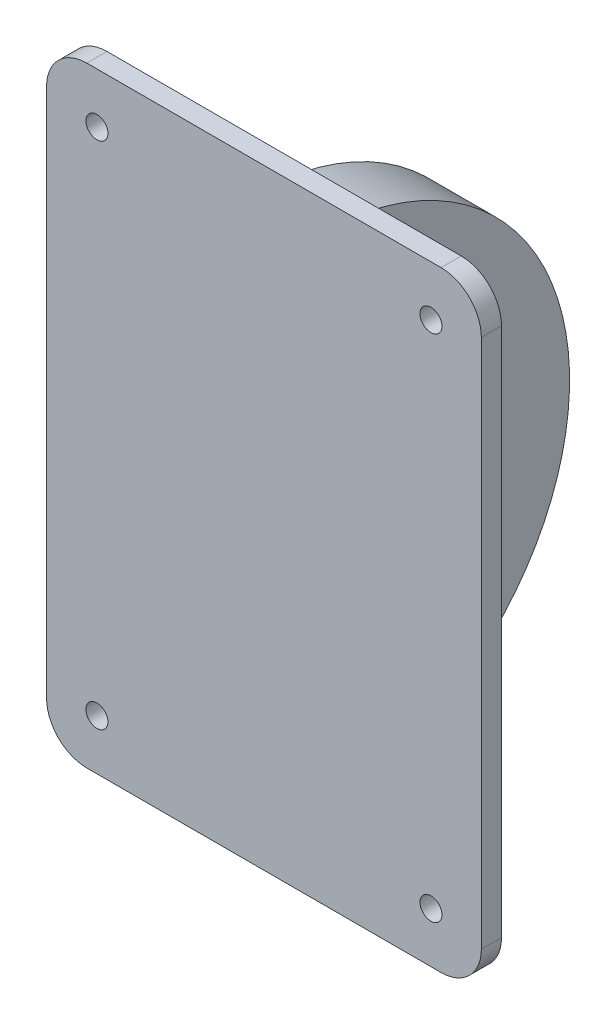
ISO-10303-21;
HEADER;
FILE_DESCRIPTION(('STEP AP214'),'2;1');
FILE_NAME('part.step','',(''),(''),'','','');
FILE_SCHEMA(('AUTOMOTIVE_DESIGN { 1 0 10303 214 1 1 1 1 }'));
ENDSEC;
DATA;
#1=APPLICATION_CONTEXT('core data for automotive mechanical design processes');
#2=APPLICATION_PROTOCOL_DEFINITION('international standard','automotive_design',2000,#1);
#3=PRODUCT_CONTEXT('',#1,'mechanical');
#4=PRODUCT('Part','Part','',(#3));
#5=PRODUCT_RELATED_PRODUCT_CATEGORY('part','',(#4));
#6=PRODUCT_DEFINITION_FORMATION('','',#4);
#7=PRODUCT_DEFINITION_CONTEXT('part definition',#1,'design');
#8=PRODUCT_DEFINITION('design','',#6,#7);
#9=PRODUCT_DEFINITION_SHAPE('','',#8);
#10=(LENGTH_UNIT() NAMED_UNIT(*) SI_UNIT(.MILLI.,.METRE.));
#11=(NAMED_UNIT(*) PLANE_ANGLE_UNIT() SI_UNIT($,.RADIAN.));
#12=(NAMED_UNIT(*) SI_UNIT($,.STERADIAN.) SOLID_ANGLE_UNIT());
#13=UNCERTAINTY_MEASURE_WITH_UNIT(LENGTH_MEASURE(1.E-05),#10,'distance_accuracy_value','');
#14=(GEOMETRIC_REPRESENTATION_CONTEXT(3) GLOBAL_UNCERTAINTY_ASSIGNED_CONTEXT((#13)) GLOBAL_UNIT_ASSIGNED_CONTEXT((#10,
#11,#12)) REPRESENTATION_CONTEXT('',''));
#15=CARTESIAN_POINT('',(0.,0.,0.));
#16=DIRECTION('',(0.,0.,1.));
#17=DIRECTION('',(1.,0.,0.));
#18=AXIS2_PLACEMENT_3D('',#15,#16,#17);
#19=CARTESIAN_POINT('',(21.57545,30.294115,2.));
#20=DIRECTION('',(-1.,0.,0.));
#21=DIRECTION('',(0.,-1.,0.));
#22=AXIS2_PLACEMENT_3D('',#19,#20,#21);
#23=PLANE('',#22);
#24=DIRECTION('',(0.,1.,0.));
#25=VECTOR('',#24,1.);
#26=CARTESIAN_POINT('',(21.57545,30.294115,2.));
#27=LINE('',#26,#25);
#28=CARTESIAN_POINT('',(21.57545,-26.294115,2.));
#29=VERTEX_POINT('',#28);
#30=CARTESIAN_POINT('',(21.57545,26.294115,2.));
#31=VERTEX_POINT('',#30);
#32=EDGE_CURVE('E163',#29,#31,#27,.T.);
#33=ORIENTED_EDGE('',*,*,#32,.F.);
#34=DIRECTION('',(0.,0.,-1.));
#35=VECTOR('',#34,1.);
#36=CARTESIAN_POINT('',(21.57545,-26.294115,2.));
#37=LINE('',#36,#35);
#38=CARTESIAN_POINT('',(21.57545,-26.294115,0.));
#39=VERTEX_POINT('',#38);
#40=EDGE_CURVE('E214',#29,#39,#37,.T.);
#41=ORIENTED_EDGE('',*,*,#40,.T.);
#42=DIRECTION('',(0.,1.,0.));
#43=VECTOR('',#42,1.);
#44=CARTESIAN_POINT('',(21.57545,30.294115,0.));
#45=LINE('',#44,#43);
#46=CARTESIAN_POINT('',(21.57545,26.294115,0.));
#47=VERTEX_POINT('',#46);
#48=EDGE_CURVE('E160',#39,#47,#45,.T.);
#49=ORIENTED_EDGE('',*,*,#48,.T.);
#50=DIRECTION('',(0.,0.,-1.));
#51=VECTOR('',#50,1.);
#52=CARTESIAN_POINT('',(21.57545,26.294115,2.));
#53=LINE('',#52,#51);
#54=EDGE_CURVE('E212',#47,#31,#53,.F.);
#55=ORIENTED_EDGE('',*,*,#54,.T.);
#56=EDGE_LOOP('',(#33,#41,#49,#55));
#57=FACE_BOUND('',#56,.T.);
#58=ADVANCED_FACE('F41',(#57),#23,.F.);
#59=CARTESIAN_POINT('',(-21.57545,30.294115,2.));
#60=DIRECTION('',(0.,-1.,0.));
#61=DIRECTION('',(0.,0.,-1.));
#62=AXIS2_PLACEMENT_3D('',#59,#60,#61);
#63=PLANE('',#62);
#64=DIRECTION('',(-1.,0.,0.));
#65=VECTOR('',#64,1.);
#66=CARTESIAN_POINT('',(-21.57545,30.294115,0.));
#67=LINE('',#66,#65);
#68=CARTESIAN_POINT('',(17.57545,30.294115,0.));
#69=VERTEX_POINT('',#68);
#70=CARTESIAN_POINT('',(-17.57545,30.294115,0.));
#71=VERTEX_POINT('',#70);
#72=EDGE_CURVE('E179',#69,#71,#67,.T.);
#73=ORIENTED_EDGE('',*,*,#72,.T.);
#74=DIRECTION('',(0.,0.,-1.));
#75=VECTOR('',#74,1.);
#76=CARTESIAN_POINT('',(-17.57545,30.294115,2.));
#77=LINE('',#76,#75);
#78=CARTESIAN_POINT('',(-17.57545,30.294115,2.));
#79=VERTEX_POINT('',#78);
#80=EDGE_CURVE('E11',#71,#79,#77,.F.);
#81=ORIENTED_EDGE('',*,*,#80,.T.);
#82=DIRECTION('',(-1.,0.,0.));
#83=VECTOR('',#82,1.);
#84=CARTESIAN_POINT('',(-21.57545,30.294115,2.));
#85=LINE('',#84,#83);
#86=CARTESIAN_POINT('',(17.57545,30.294115,2.));
#87=VERTEX_POINT('',#86);
#88=EDGE_CURVE('E166',#87,#79,#85,.T.);
#89=ORIENTED_EDGE('',*,*,#88,.F.);
#90=DIRECTION('',(0.,0.,-1.));
#91=VECTOR('',#90,1.);
#92=CARTESIAN_POINT('',(17.57545,30.294115,2.));
#93=LINE('',#92,#91);
#94=EDGE_CURVE('E49',#87,#69,#93,.T.);
#95=ORIENTED_EDGE('',*,*,#94,.T.);
#96=EDGE_LOOP('',(#73,#81,#89,#95));
#97=FACE_BOUND('',#96,.T.);
#98=ADVANCED_FACE('F221',(#97),#63,.F.);
#99=CARTESIAN_POINT('',(-21.57545,30.294115,2.));
#100=DIRECTION('',(1.,0.,0.));
#101=DIRECTION('',(0.,1.,0.));
#102=AXIS2_PLACEMENT_3D('',#99,#100,#101);
#103=PLANE('',#102);
#104=DIRECTION('',(0.,-1.,0.));
#105=VECTOR('',#104,1.);
#106=CARTESIAN_POINT('',(-21.57545,30.294115,0.));
#107=LINE('',#106,#105);
#108=CARTESIAN_POINT('',(-21.57545,26.294115,0.));
#109=VERTEX_POINT('',#108);
#110=CARTESIAN_POINT('',(-21.57545,-26.294115,0.));
#111=VERTEX_POINT('',#110);
#112=EDGE_CURVE('E182',#109,#111,#107,.T.);
#113=ORIENTED_EDGE('',*,*,#112,.T.);
#114=DIRECTION('',(0.,0.,-1.));
#115=VECTOR('',#114,1.);
#116=CARTESIAN_POINT('',(-21.57545,-26.294115,2.));
#117=LINE('',#116,#115);
#118=CARTESIAN_POINT('',(-21.57545,-26.294115,2.));
#119=VERTEX_POINT('',#118);
#120=EDGE_CURVE('E202',#111,#119,#117,.F.);
#121=ORIENTED_EDGE('',*,*,#120,.T.);
#122=DIRECTION('',(0.,-1.,0.));
#123=VECTOR('',#122,1.);
#124=CARTESIAN_POINT('',(-21.57545,30.294115,2.));
#125=LINE('',#124,#123);
#126=CARTESIAN_POINT('',(-21.57545,26.294115,2.));
#127=VERTEX_POINT('',#126);
#128=EDGE_CURVE('E170',#127,#119,#125,.T.);
#129=ORIENTED_EDGE('',*,*,#128,.F.);
#130=DIRECTION('',(0.,0.,-1.));
#131=VECTOR('',#130,1.);
#132=CARTESIAN_POINT('',(-21.57545,26.294115,2.));
#133=LINE('',#132,#131);
#134=EDGE_CURVE('E199',#127,#109,#133,.T.);
#135=ORIENTED_EDGE('',*,*,#134,.T.);
#136=EDGE_LOOP('',(#113,#121,#129,#135));
#137=FACE_BOUND('',#136,.T.);
#138=ADVANCED_FACE('F235',(#137),#103,.F.);
#139=CARTESIAN_POINT('',(-21.57545,-30.294115,2.));
#140=DIRECTION('',(0.,1.,0.));
#141=DIRECTION('',(0.,0.,1.));
#142=AXIS2_PLACEMENT_3D('',#139,#140,#141);
#143=PLANE('',#142);
#144=DIRECTION('',(1.,0.,0.));
#145=VECTOR('',#144,1.);
#146=CARTESIAN_POINT('',(-21.57545,-30.294115,2.));
#147=LINE('',#146,#145);
#148=CARTESIAN_POINT('',(-17.57545,-30.294115,2.));
#149=VERTEX_POINT('',#148);
#150=CARTESIAN_POINT('',(17.57545,-30.294115,2.));
#151=VERTEX_POINT('',#150);
#152=EDGE_CURVE('E173',#149,#151,#147,.T.);
#153=ORIENTED_EDGE('',*,*,#152,.F.);
#154=DIRECTION('',(0.,0.,-1.));
#155=VECTOR('',#154,1.);
#156=CARTESIAN_POINT('',(-17.57545,-30.294115,2.));
#157=LINE('',#156,#155);
#158=CARTESIAN_POINT('',(-17.57545,-30.294115,0.));
#159=VERTEX_POINT('',#158);
#160=EDGE_CURVE('E188',#149,#159,#157,.T.);
#161=ORIENTED_EDGE('',*,*,#160,.T.);
#162=DIRECTION('',(1.,0.,0.));
#163=VECTOR('',#162,1.);
#164=CARTESIAN_POINT('',(-21.57545,-30.294115,0.));
#165=LINE('',#164,#163);
#166=CARTESIAN_POINT('',(17.57545,-30.294115,0.));
#167=VERTEX_POINT('',#166);
#168=EDGE_CURVE('E167',#159,#167,#165,.T.);
#169=ORIENTED_EDGE('',*,*,#168,.T.);
#170=DIRECTION('',(0.,0.,-1.));
#171=VECTOR('',#170,1.);
#172=CARTESIAN_POINT('',(17.57545,-30.294115,2.));
#173=LINE('',#172,#171);
#174=EDGE_CURVE('E176',#167,#151,#173,.F.);
#175=ORIENTED_EDGE('',*,*,#174,.T.);
#176=EDGE_LOOP('',(#153,#161,#169,#175));
#177=FACE_BOUND('',#176,.T.);
#178=ADVANCED_FACE('F245',(#177),#143,.F.);
#179=CARTESIAN_POINT('',(0.,0.,2.));
#180=DIRECTION('',(0.,0.,1.));
#181=DIRECTION('',(1.,0.,0.));
#182=AXIS2_PLACEMENT_3D('',#179,#180,#181);
#183=PLANE('',#182);
#184=CARTESIAN_POINT('',(16.57545,25.294115,2.));
#185=DIRECTION('',(0.,0.,1.));
#186=DIRECTION('',(1.,0.,0.));
#187=AXIS2_PLACEMENT_3D('',#184,#185,#186);
#188=CIRCLE('',#187,1.0922);
#189=CARTESIAN_POINT('',(17.66765,25.294115,2.));
#190=VERTEX_POINT('',#189);
#191=EDGE_CURVE('E145',#190,#190,#188,.T.);
#192=ORIENTED_EDGE('',*,*,#191,.F.);
#193=EDGE_LOOP('',(#192));
#194=FACE_BOUND('',#193,.T.);
#195=CARTESIAN_POINT('',(-16.57545,-25.294115,2.));
#196=DIRECTION('',(0.,0.,1.));
#197=DIRECTION('',(1.,0.,0.));
#198=AXIS2_PLACEMENT_3D('',#195,#196,#197);
#199=CIRCLE('',#198,1.0922);
#200=CARTESIAN_POINT('',(-15.48325,-25.294115,2.));
#201=VERTEX_POINT('',#200);
#202=EDGE_CURVE('E152',#201,#201,#199,.T.);
#203=ORIENTED_EDGE('',*,*,#202,.F.);
#204=EDGE_LOOP('',(#203));
#205=FACE_BOUND('',#204,.T.);
#206=CARTESIAN_POINT('',(16.57545,-25.294115,2.));
#207=DIRECTION('',(0.,0.,1.));
#208=DIRECTION('',(1.,0.,0.));
#209=AXIS2_PLACEMENT_3D('',#206,#207,#208);
#210=CIRCLE('',#209,1.0922);
#211=CARTESIAN_POINT('',(17.66765,-25.294115,2.));
#212=VERTEX_POINT('',#211);
#213=EDGE_CURVE('E139',#212,#212,#210,.T.);
#214=ORIENTED_EDGE('',*,*,#213,.F.);
#215=EDGE_LOOP('',(#214));
#216=FACE_BOUND('',#215,.T.);
#217=CARTESIAN_POINT('',(-16.57545,25.294115,2.));
#218=DIRECTION('',(0.,0.,1.));
#219=DIRECTION('',(1.,0.,0.));
#220=AXIS2_PLACEMENT_3D('',#217,#218,#219);
#221=CIRCLE('',#220,1.0922);
#222=CARTESIAN_POINT('',(-15.48325,25.294115,2.));
#223=VERTEX_POINT('',#222);
#224=EDGE_CURVE('E148',#223,#223,#221,.T.);
#225=ORIENTED_EDGE('',*,*,#224,.F.);
#226=EDGE_LOOP('',(#225));
#227=FACE_BOUND('',#226,.T.);
#228=ORIENTED_EDGE('',*,*,#128,.T.);
#229=CARTESIAN_POINT('',(-17.57545,-26.294115,2.));
#230=DIRECTION('',(0.,0.,1.));
#231=DIRECTION('',(1.,0.,0.));
#232=AXIS2_PLACEMENT_3D('',#229,#230,#231);
#233=CIRCLE('',#232,4.);
#234=EDGE_CURVE('E210',#119,#149,#233,.T.);
#235=ORIENTED_EDGE('',*,*,#234,.T.);
#236=ORIENTED_EDGE('',*,*,#152,.T.);
#237=CARTESIAN_POINT('',(17.57545,-26.294115,2.));
#238=DIRECTION('',(0.,0.,1.));
#239=DIRECTION('',(1.,0.,0.));
#240=AXIS2_PLACEMENT_3D('',#237,#238,#239);
#241=CIRCLE('',#240,4.);
#242=EDGE_CURVE('E208',#151,#29,#241,.T.);
#243=ORIENTED_EDGE('',*,*,#242,.T.);
#244=ORIENTED_EDGE('',*,*,#32,.T.);
#245=CARTESIAN_POINT('',(17.57545,26.294115,2.));
#246=DIRECTION('',(0.,0.,1.));
#247=DIRECTION('',(1.,0.,0.));
#248=AXIS2_PLACEMENT_3D('',#245,#246,#247);
#249=CIRCLE('',#248,4.);
#250=EDGE_CURVE('E204',#31,#87,#249,.T.);
#251=ORIENTED_EDGE('',*,*,#250,.T.);
#252=ORIENTED_EDGE('',*,*,#88,.T.);
#253=CARTESIAN_POINT('',(-17.57545,26.294115,2.));
#254=DIRECTION('',(0.,0.,1.));
#255=DIRECTION('',(1.,0.,0.));
#256=AXIS2_PLACEMENT_3D('',#253,#254,#255);
#257=CIRCLE('',#256,4.);
#258=EDGE_CURVE('E206',#79,#127,#257,.T.);
#259=ORIENTED_EDGE('',*,*,#258,.T.);
#260=EDGE_LOOP('',(#228,#235,#236,#243,#244,#251,#252,#259));
#261=FACE_BOUND('',#260,.T.);
#262=ADVANCED_FACE('F239',(#194,#205,#216,#227,#261),#183,.T.);
#263=CARTESIAN_POINT('',(0.,0.,0.));
#264=DIRECTION('',(0.,0.,1.));
#265=DIRECTION('',(1.,0.,0.));
#266=AXIS2_PLACEMENT_3D('',#263,#264,#265);
#267=PLANE('',#266);
#268=DIRECTION('',(-1.,0.,0.));
#269=VECTOR('',#268,1.);
#270=CARTESIAN_POINT('',(3.33333333333333,-25.,0.));
#271=LINE('',#270,#269);
#272=CARTESIAN_POINT('',(3.33333333333333,-25.,0.));
#273=VERTEX_POINT('',#272);
#274=CARTESIAN_POINT('',(-3.33333333333333,-25.,0.));
#275=VERTEX_POINT('',#274);
#276=EDGE_CURVE('E61',#273,#275,#271,.T.);
#277=ORIENTED_EDGE('',*,*,#276,.F.);
#278=DIRECTION('',(0.,-1.,0.));
#279=VECTOR('',#278,1.);
#280=CARTESIAN_POINT('',(3.33333333333333,25.,0.));
#281=LINE('',#280,#279);
#282=CARTESIAN_POINT('',(3.33333333333333,25.,0.));
#283=VERTEX_POINT('',#282);
#284=EDGE_CURVE('E56',#283,#273,#281,.T.);
#285=ORIENTED_EDGE('',*,*,#284,.F.);
#286=DIRECTION('',(-1.,0.,0.));
#287=VECTOR('',#286,1.);
#288=CARTESIAN_POINT('',(3.33333333333333,25.,0.));
#289=LINE('',#288,#287);
#290=CARTESIAN_POINT('',(-3.33333333333333,25.,0.));
#291=VERTEX_POINT('',#290);
#292=EDGE_CURVE('E113',#283,#291,#289,.T.);
#293=ORIENTED_EDGE('',*,*,#292,.T.);
#294=DIRECTION('',(0.,-1.,0.));
#295=VECTOR('',#294,1.);
#296=CARTESIAN_POINT('',(-3.33333333333333,25.,0.));
#297=LINE('',#296,#295);
#298=EDGE_CURVE('E117',#291,#275,#297,.T.);
#299=ORIENTED_EDGE('',*,*,#298,.T.);
#300=EDGE_LOOP('',(#277,#285,#293,#299));
#301=FACE_BOUND('',#300,.T.);
#302=CARTESIAN_POINT('',(16.57545,25.294115,0.));
#303=DIRECTION('',(0.,0.,1.));
#304=DIRECTION('',(1.,0.,0.));
#305=AXIS2_PLACEMENT_3D('',#302,#303,#304);
#306=CIRCLE('',#305,1.0922);
#307=CARTESIAN_POINT('',(17.66765,25.294115,0.));
#308=VERTEX_POINT('',#307);
#309=EDGE_CURVE('E149',#308,#308,#306,.T.);
#310=ORIENTED_EDGE('',*,*,#309,.T.);
#311=EDGE_LOOP('',(#310));
#312=FACE_BOUND('',#311,.T.);
#313=CARTESIAN_POINT('',(-16.57545,-25.294115,0.));
#314=DIRECTION('',(0.,0.,1.));
#315=DIRECTION('',(1.,0.,0.));
#316=AXIS2_PLACEMENT_3D('',#313,#314,#315);
#317=CIRCLE('',#316,1.0922);
#318=CARTESIAN_POINT('',(-15.48325,-25.294115,0.));
#319=VERTEX_POINT('',#318);
#320=EDGE_CURVE('E142',#319,#319,#317,.T.);
#321=ORIENTED_EDGE('',*,*,#320,.T.);
#322=EDGE_LOOP('',(#321));
#323=FACE_BOUND('',#322,.T.);
#324=CARTESIAN_POINT('',(16.57545,-25.294115,0.));
#325=DIRECTION('',(0.,0.,1.));
#326=DIRECTION('',(1.,0.,0.));
#327=AXIS2_PLACEMENT_3D('',#324,#325,#326);
#328=CIRCLE('',#327,1.0922);
#329=CARTESIAN_POINT('',(17.66765,-25.294115,0.));
#330=VERTEX_POINT('',#329);
#331=EDGE_CURVE('E121',#330,#330,#328,.T.);
#332=ORIENTED_EDGE('',*,*,#331,.T.);
#333=EDGE_LOOP('',(#332));
#334=FACE_BOUND('',#333,.T.);
#335=CARTESIAN_POINT('',(-16.57545,25.294115,0.));
#336=DIRECTION('',(0.,0.,1.));
#337=DIRECTION('',(1.,0.,0.));
#338=AXIS2_PLACEMENT_3D('',#335,#336,#337);
#339=CIRCLE('',#338,1.0922);
#340=CARTESIAN_POINT('',(-15.48325,25.294115,0.));
#341=VERTEX_POINT('',#340);
#342=EDGE_CURVE('E157',#341,#341,#339,.T.);
#343=ORIENTED_EDGE('',*,*,#342,.T.);
#344=EDGE_LOOP('',(#343));
#345=FACE_BOUND('',#344,.T.);
#346=ORIENTED_EDGE('',*,*,#168,.F.);
#347=CARTESIAN_POINT('',(-17.57545,-26.294115,0.));
#348=DIRECTION('',(0.,0.,1.));
#349=DIRECTION('',(1.,0.,0.));
#350=AXIS2_PLACEMENT_3D('',#347,#348,#349);
#351=CIRCLE('',#350,4.);
#352=EDGE_CURVE('E197',#159,#111,#351,.F.);
#353=ORIENTED_EDGE('',*,*,#352,.T.);
#354=ORIENTED_EDGE('',*,*,#112,.F.);
#355=CARTESIAN_POINT('',(-17.57545,26.294115,0.));
#356=DIRECTION('',(0.,0.,1.));
#357=DIRECTION('',(1.,0.,0.));
#358=AXIS2_PLACEMENT_3D('',#355,#356,#357);
#359=CIRCLE('',#358,4.);
#360=EDGE_CURVE('E193',#109,#71,#359,.F.);
#361=ORIENTED_EDGE('',*,*,#360,.T.);
#362=ORIENTED_EDGE('',*,*,#72,.F.);
#363=CARTESIAN_POINT('',(17.57545,26.294115,0.));
#364=DIRECTION('',(0.,0.,1.));
#365=DIRECTION('',(1.,0.,0.));
#366=AXIS2_PLACEMENT_3D('',#363,#364,#365);
#367=CIRCLE('',#366,4.);
#368=EDGE_CURVE('E191',#69,#47,#367,.F.);
#369=ORIENTED_EDGE('',*,*,#368,.T.);
#370=ORIENTED_EDGE('',*,*,#48,.F.);
#371=CARTESIAN_POINT('',(17.57545,-26.294115,0.));
#372=DIRECTION('',(0.,0.,1.));
#373=DIRECTION('',(1.,0.,0.));
#374=AXIS2_PLACEMENT_3D('',#371,#372,#373);
#375=CIRCLE('',#374,4.);
#376=EDGE_CURVE('E195',#39,#167,#375,.F.);
#377=ORIENTED_EDGE('',*,*,#376,.T.);
#378=EDGE_LOOP('',(#346,#353,#354,#361,#362,#369,#370,#377));
#379=FACE_BOUND('',#378,.T.);
#380=ADVANCED_FACE('F115',(#301,#312,#323,#334,#345,#379),#267,.F.);
#381=CARTESIAN_POINT('',(-17.57545,-26.294115,2.));
#382=DIRECTION('',(0.,0.,-1.));
#383=DIRECTION('',(-1.,0.,0.));
#384=AXIS2_PLACEMENT_3D('',#381,#382,#383);
#385=CYLINDRICAL_SURFACE('',#384,4.);
#386=ORIENTED_EDGE('',*,*,#234,.F.);
#387=ORIENTED_EDGE('',*,*,#120,.F.);
#388=ORIENTED_EDGE('',*,*,#352,.F.);
#389=ORIENTED_EDGE('',*,*,#160,.F.);
#390=EDGE_LOOP('',(#386,#387,#388,#389));
#391=FACE_BOUND('',#390,.T.);
#392=ADVANCED_FACE('F243',(#391),#385,.T.);
#393=CARTESIAN_POINT('',(17.57545,-26.294115,2.));
#394=DIRECTION('',(0.,0.,-1.));
#395=DIRECTION('',(-1.,0.,0.));
#396=AXIS2_PLACEMENT_3D('',#393,#394,#395);
#397=CYLINDRICAL_SURFACE('',#396,4.);
#398=ORIENTED_EDGE('',*,*,#242,.F.);
#399=ORIENTED_EDGE('',*,*,#174,.F.);
#400=ORIENTED_EDGE('',*,*,#376,.F.);
#401=ORIENTED_EDGE('',*,*,#40,.F.);
#402=EDGE_LOOP('',(#398,#399,#400,#401));
#403=FACE_BOUND('',#402,.T.);
#404=ADVANCED_FACE('F250',(#403),#397,.T.);
#405=CARTESIAN_POINT('',(-17.57545,26.294115,2.));
#406=DIRECTION('',(0.,0.,-1.));
#407=DIRECTION('',(-1.,0.,0.));
#408=AXIS2_PLACEMENT_3D('',#405,#406,#407);
#409=CYLINDRICAL_SURFACE('',#408,4.);
#410=ORIENTED_EDGE('',*,*,#258,.F.);
#411=ORIENTED_EDGE('',*,*,#80,.F.);
#412=ORIENTED_EDGE('',*,*,#360,.F.);
#413=ORIENTED_EDGE('',*,*,#134,.F.);
#414=EDGE_LOOP('',(#410,#411,#412,#413));
#415=FACE_BOUND('',#414,.T.);
#416=ADVANCED_FACE('F232',(#415),#409,.T.);
#417=CARTESIAN_POINT('',(17.57545,26.294115,2.));
#418=DIRECTION('',(0.,0.,-1.));
#419=DIRECTION('',(-1.,0.,0.));
#420=AXIS2_PLACEMENT_3D('',#417,#418,#419);
#421=CYLINDRICAL_SURFACE('',#420,4.);
#422=ORIENTED_EDGE('',*,*,#250,.F.);
#423=ORIENTED_EDGE('',*,*,#54,.F.);
#424=ORIENTED_EDGE('',*,*,#368,.F.);
#425=ORIENTED_EDGE('',*,*,#94,.F.);
#426=EDGE_LOOP('',(#422,#423,#424,#425));
#427=FACE_BOUND('',#426,.T.);
#428=ADVANCED_FACE('F43',(#427),#421,.T.);
#429=CARTESIAN_POINT('',(-16.57545,25.294115,0.));
#430=DIRECTION('',(0.,0.,1.));
#431=DIRECTION('',(1.,0.,0.));
#432=AXIS2_PLACEMENT_3D('',#429,#430,#431);
#433=CYLINDRICAL_SURFACE('',#432,1.0922);
#434=ORIENTED_EDGE('',*,*,#342,.F.);
#435=EDGE_LOOP('',(#434));
#436=FACE_BOUND('',#435,.T.);
#437=ORIENTED_EDGE('',*,*,#224,.T.);
#438=EDGE_LOOP('',(#437));
#439=FACE_BOUND('',#438,.T.);
#440=ADVANCED_FACE('F255',(#436,#439),#433,.F.);
#441=CARTESIAN_POINT('',(16.57545,-25.294115,0.));
#442=DIRECTION('',(0.,0.,1.));
#443=DIRECTION('',(1.,0.,0.));
#444=AXIS2_PLACEMENT_3D('',#441,#442,#443);
#445=CYLINDRICAL_SURFACE('',#444,1.0922);
#446=ORIENTED_EDGE('',*,*,#331,.F.);
#447=EDGE_LOOP('',(#446));
#448=FACE_BOUND('',#447,.T.);
#449=ORIENTED_EDGE('',*,*,#213,.T.);
#450=EDGE_LOOP('',(#449));
#451=FACE_BOUND('',#450,.T.);
#452=ADVANCED_FACE('F260',(#448,#451),#445,.F.);
#453=CARTESIAN_POINT('',(-16.57545,-25.294115,0.));
#454=DIRECTION('',(0.,0.,1.));
#455=DIRECTION('',(1.,0.,0.));
#456=AXIS2_PLACEMENT_3D('',#453,#454,#455);
#457=CYLINDRICAL_SURFACE('',#456,1.0922);
#458=ORIENTED_EDGE('',*,*,#320,.F.);
#459=EDGE_LOOP('',(#458));
#460=FACE_BOUND('',#459,.T.);
#461=ORIENTED_EDGE('',*,*,#202,.T.);
#462=EDGE_LOOP('',(#461));
#463=FACE_BOUND('',#462,.T.);
#464=ADVANCED_FACE('F323',(#460,#463),#457,.F.);
#465=CARTESIAN_POINT('',(16.57545,25.294115,0.));
#466=DIRECTION('',(0.,0.,1.));
#467=DIRECTION('',(1.,0.,0.));
#468=AXIS2_PLACEMENT_3D('',#465,#466,#467);
#469=CYLINDRICAL_SURFACE('',#468,1.0922);
#470=ORIENTED_EDGE('',*,*,#309,.F.);
#471=EDGE_LOOP('',(#470));
#472=FACE_BOUND('',#471,.T.);
#473=ORIENTED_EDGE('',*,*,#191,.T.);
#474=EDGE_LOOP('',(#473));
#475=FACE_BOUND('',#474,.T.);
#476=ADVANCED_FACE('F338',(#472,#475),#469,.F.);
#477=CARTESIAN_POINT('',(3.33333333333333,0.,0.));
#478=DIRECTION('',(-1.,0.,0.));
#479=DIRECTION('',(0.,0.,1.));
#480=AXIS2_PLACEMENT_3D('',#477,#478,#479);
#481=CYLINDRICAL_SURFACE('',#480,25.);
#482=CARTESIAN_POINT('',(-3.33333333333333,0.,0.));
#483=DIRECTION('',(1.,0.,0.));
#484=DIRECTION('',(0.,0.,-1.));
#485=AXIS2_PLACEMENT_3D('',#482,#483,#484);
#486=CIRCLE('',#485,25.);
#487=EDGE_CURVE('E126',#275,#291,#486,.T.);
#488=ORIENTED_EDGE('',*,*,#487,.T.);
#489=ORIENTED_EDGE('',*,*,#292,.F.);
#490=CARTESIAN_POINT('',(3.33333333333333,0.,0.));
#491=DIRECTION('',(1.,0.,0.));
#492=DIRECTION('',(0.,0.,-1.));
#493=AXIS2_PLACEMENT_3D('',#490,#491,#492);
#494=CIRCLE('',#493,25.);
#495=EDGE_CURVE('E127',#273,#283,#494,.T.);
#496=ORIENTED_EDGE('',*,*,#495,.F.);
#497=ORIENTED_EDGE('',*,*,#276,.T.);
#498=EDGE_LOOP('',(#488,#489,#496,#497));
#499=FACE_BOUND('',#498,.T.);
#500=ADVANCED_FACE('F129',(#499),#481,.T.);
#501=CARTESIAN_POINT('',(3.33333333333333,0.,0.));
#502=DIRECTION('',(1.,0.,0.));
#503=DIRECTION('',(0.,0.,-1.));
#504=AXIS2_PLACEMENT_3D('',#501,#502,#503);
#505=PLANE('',#504);
#506=CARTESIAN_POINT('',(3.33333333333333,0.,-10.61));
#507=DIRECTION('',(1.,0.,0.));
#508=DIRECTION('',(0.,0.,-1.));
#509=AXIS2_PLACEMENT_3D('',#506,#507,#508);
#510=CIRCLE('',#509,3.);
#511=CARTESIAN_POINT('',(3.33333333333333,0.,-13.61));
#512=VERTEX_POINT('',#511);
#513=EDGE_CURVE('E133',#512,#512,#510,.T.);
#514=ORIENTED_EDGE('',*,*,#513,.F.);
#515=EDGE_LOOP('',(#514));
#516=FACE_BOUND('',#515,.T.);
#517=ORIENTED_EDGE('',*,*,#495,.T.);
#518=ORIENTED_EDGE('',*,*,#284,.T.);
#519=EDGE_LOOP('',(#517,#518));
#520=FACE_BOUND('',#519,.T.);
#521=ADVANCED_FACE('F369',(#516,#520),#505,.T.);
#522=CARTESIAN_POINT('',(-3.33333333333333,0.,0.));
#523=DIRECTION('',(1.,0.,0.));
#524=DIRECTION('',(0.,0.,-1.));
#525=AXIS2_PLACEMENT_3D('',#522,#523,#524);
#526=PLANE('',#525);
#527=CARTESIAN_POINT('',(-3.33333333333333,0.,-10.61));
#528=DIRECTION('',(1.,0.,0.));
#529=DIRECTION('',(0.,0.,-1.));
#530=AXIS2_PLACEMENT_3D('',#527,#528,#529);
#531=CIRCLE('',#530,3.);
#532=CARTESIAN_POINT('',(-3.33333333333333,0.,-13.61));
#533=VERTEX_POINT('',#532);
#534=EDGE_CURVE('E130',#533,#533,#531,.F.);
#535=ORIENTED_EDGE('',*,*,#534,.F.);
#536=EDGE_LOOP('',(#535));
#537=FACE_BOUND('',#536,.T.);
#538=ORIENTED_EDGE('',*,*,#487,.F.);
#539=ORIENTED_EDGE('',*,*,#298,.F.);
#540=EDGE_LOOP('',(#538,#539));
#541=FACE_BOUND('',#540,.T.);
#542=ADVANCED_FACE('F125',(#537,#541),#526,.F.);
#543=CARTESIAN_POINT('',(-21.57645,0.,-10.61));
#544=DIRECTION('',(1.,0.,0.));
#545=DIRECTION('',(0.,0.,-1.));
#546=AXIS2_PLACEMENT_3D('',#543,#544,#545);
#547=CYLINDRICAL_SURFACE('',#546,3.);
#548=ORIENTED_EDGE('',*,*,#513,.T.);
#549=EDGE_LOOP('',(#548));
#550=FACE_BOUND('',#549,.T.);
#551=ORIENTED_EDGE('',*,*,#534,.T.);
#552=EDGE_LOOP('',(#551));
#553=FACE_BOUND('',#552,.T.);
#554=ADVANCED_FACE('F389',(#550,#553),#547,.F.);
#555=CLOSED_SHELL('',(#58,#98,#138,#178,#262,#380,#392,#404,#416,#428,#440,#452,#464,#476,#500,
#521,#542,#554));
#556=MANIFOLD_SOLID_BREP('B2',#555);
#557=ADVANCED_BREP_SHAPE_REPRESENTATION('',(#18,#556),#14);
#558=SHAPE_DEFINITION_REPRESENTATION(#9,#557);
ENDSEC;
END-ISO-10303-21;
